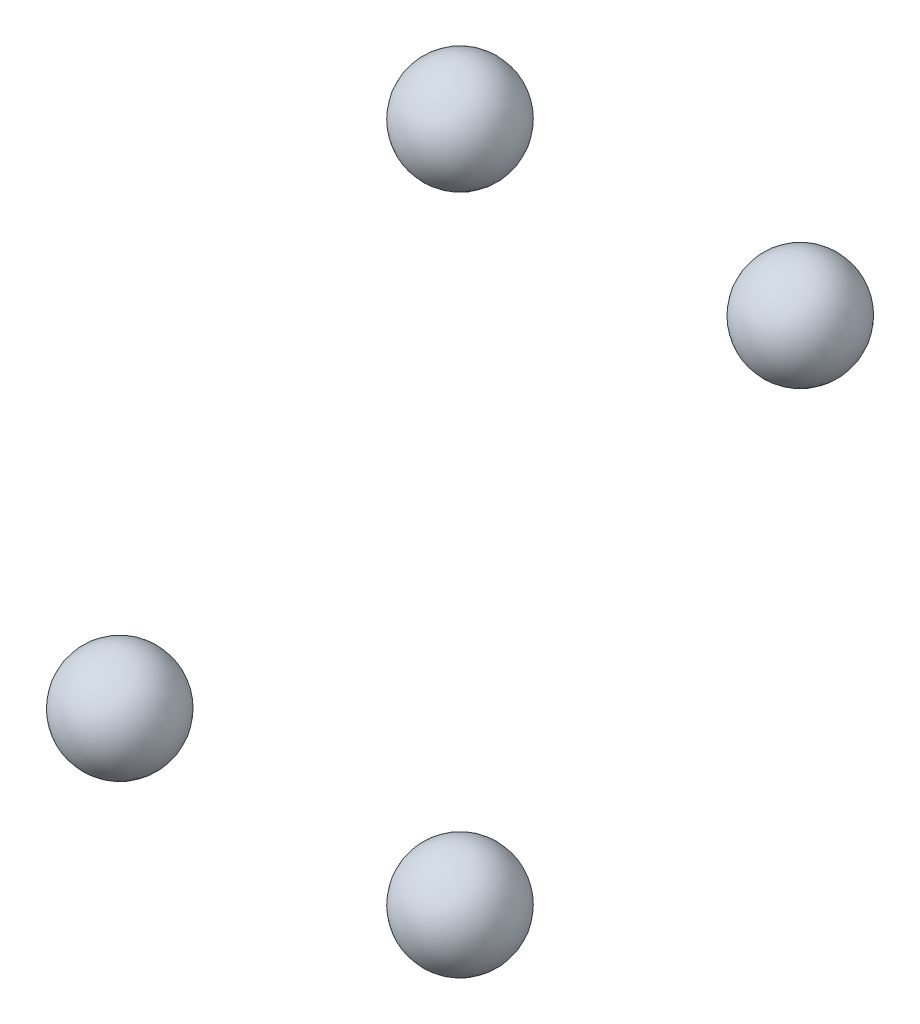
ISO-10303-21;
HEADER;
FILE_DESCRIPTION(('STEP AP214'),'2;1');
FILE_NAME('part.step','',(''),(''),'','','');
FILE_SCHEMA(('AUTOMOTIVE_DESIGN { 1 0 10303 214 1 1 1 1 }'));
ENDSEC;
DATA;
#1=APPLICATION_CONTEXT('core data for automotive mechanical design processes');
#2=APPLICATION_PROTOCOL_DEFINITION('international standard','automotive_design',2000,#1);
#3=PRODUCT_CONTEXT('',#1,'mechanical');
#4=PRODUCT('Part','Part','',(#3));
#5=PRODUCT_RELATED_PRODUCT_CATEGORY('part','',(#4));
#6=PRODUCT_DEFINITION_FORMATION('','',#4);
#7=PRODUCT_DEFINITION_CONTEXT('part definition',#1,'design');
#8=PRODUCT_DEFINITION('design','',#6,#7);
#9=PRODUCT_DEFINITION_SHAPE('','',#8);
#10=(LENGTH_UNIT() NAMED_UNIT(*) SI_UNIT(.MILLI.,.METRE.));
#11=(NAMED_UNIT(*) PLANE_ANGLE_UNIT() SI_UNIT($,.RADIAN.));
#12=(NAMED_UNIT(*) SI_UNIT($,.STERADIAN.) SOLID_ANGLE_UNIT());
#13=UNCERTAINTY_MEASURE_WITH_UNIT(LENGTH_MEASURE(1.E-05),#10,'distance_accuracy_value','');
#14=(GEOMETRIC_REPRESENTATION_CONTEXT(3) GLOBAL_UNCERTAINTY_ASSIGNED_CONTEXT((#13)) GLOBAL_UNIT_ASSIGNED_CONTEXT((#10,
#11,#12)) REPRESENTATION_CONTEXT('',''));
#15=CARTESIAN_POINT('',(0.,0.,0.));
#16=DIRECTION('',(0.,0.,1.));
#17=DIRECTION('',(1.,0.,0.));
#18=AXIS2_PLACEMENT_3D('',#15,#16,#17);
#19=CARTESIAN_POINT('',(8.,21.,0.));
#20=DIRECTION('',(0.0741532166459954,0.232212027956595,0.969834457282962));
#21=DIRECTION('',(0.461667715902958,-0.870016855029399,0.173013271334022));
#22=AXIS2_PLACEMENT_3D('',#19,#20,#21);
#23=SPHERICAL_SURFACE('',#22,3.2);
#24=CARTESIAN_POINT('',(7.76270970673282,20.2569215105389,-3.10347026330548));
#25=VERTEX_POINT('',#24);
#26=VERTEX_LOOP('',#25);
#27=FACE_BOUND('',#26,.T.);
#28=CARTESIAN_POINT('',(8.23729029326718,21.7430784894611,3.10347026330548));
#29=VERTEX_POINT('',#28);
#30=VERTEX_LOOP('',#29);
#31=FACE_BOUND('',#30,.T.);
#32=ADVANCED_FACE('P0_F15',(#27,#31),#23,.T.);
#33=CLOSED_SHELL('',(#32));
#34=MANIFOLD_SOLID_BREP('P0_B1',#33);
#35=CARTESIAN_POINT('',(8.,-21.,0.));
#36=DIRECTION('',(0.0741532166459954,0.232212027956595,0.969834457282962));
#37=DIRECTION('',(0.461667715902958,-0.870016855029399,0.173013271334022));
#38=AXIS2_PLACEMENT_3D('',#35,#36,#37);
#39=SPHERICAL_SURFACE('',#38,3.2);
#40=CARTESIAN_POINT('',(8.23729029326718,-20.2569215105389,3.10347026330548));
#41=VERTEX_POINT('',#40);
#42=VERTEX_LOOP('',#41);
#43=FACE_BOUND('',#42,.T.);
#44=CARTESIAN_POINT('',(7.76270970673282,-21.7430784894611,-3.10347026330548));
#45=VERTEX_POINT('',#44);
#46=VERTEX_LOOP('',#45);
#47=FACE_BOUND('',#46,.T.);
#48=ADVANCED_FACE('P1_F15',(#43,#47),#39,.T.);
#49=CLOSED_SHELL('',(#48));
#50=MANIFOLD_SOLID_BREP('P1_B1',#49);
#51=CARTESIAN_POINT('',(8.,0.,-21.));
#52=DIRECTION('',(0.0741532166459954,0.232212027956595,0.969834457282962));
#53=DIRECTION('',(0.461667715902958,-0.870016855029399,0.173013271334022));
#54=AXIS2_PLACEMENT_3D('',#51,#52,#53);
#55=SPHERICAL_SURFACE('',#54,3.2);
#56=CARTESIAN_POINT('',(8.23729029326719,0.743078489461103,-17.8965297366945));
#57=VERTEX_POINT('',#56);
#58=VERTEX_LOOP('',#57);
#59=FACE_BOUND('',#58,.T.);
#60=CARTESIAN_POINT('',(7.76270970673282,-0.743078489461103,-24.1034702633055));
#61=VERTEX_POINT('',#60);
#62=VERTEX_LOOP('',#61);
#63=FACE_BOUND('',#62,.T.);
#64=ADVANCED_FACE('P2_F15',(#59,#63),#55,.T.);
#65=CLOSED_SHELL('',(#64));
#66=MANIFOLD_SOLID_BREP('P2_B1',#65);
#67=CARTESIAN_POINT('',(8.,0.,21.));
#68=DIRECTION('',(0.0741532166459954,0.232212027956595,0.969834457282962));
#69=DIRECTION('',(0.461667715902958,-0.870016855029399,0.173013271334022));
#70=AXIS2_PLACEMENT_3D('',#67,#68,#69);
#71=SPHERICAL_SURFACE('',#70,3.2);
#72=CARTESIAN_POINT('',(7.76270970673281,-0.743078489461103,17.8965297366945));
#73=VERTEX_POINT('',#72);
#74=VERTEX_LOOP('',#73);
#75=FACE_BOUND('',#74,.T.);
#76=CARTESIAN_POINT('',(8.23729029326718,0.743078489461103,24.1034702633055));
#77=VERTEX_POINT('',#76);
#78=VERTEX_LOOP('',#77);
#79=FACE_BOUND('',#78,.T.);
#80=ADVANCED_FACE('P3_F15',(#75,#79),#71,.T.);
#81=CLOSED_SHELL('',(#80));
#82=MANIFOLD_SOLID_BREP('P3_B1',#81);
#83=ADVANCED_BREP_SHAPE_REPRESENTATION('',(#18,#34,#50,#66,#82),#14);
#84=SHAPE_DEFINITION_REPRESENTATION(#9,#83);
ENDSEC;
END-ISO-10303-21;
